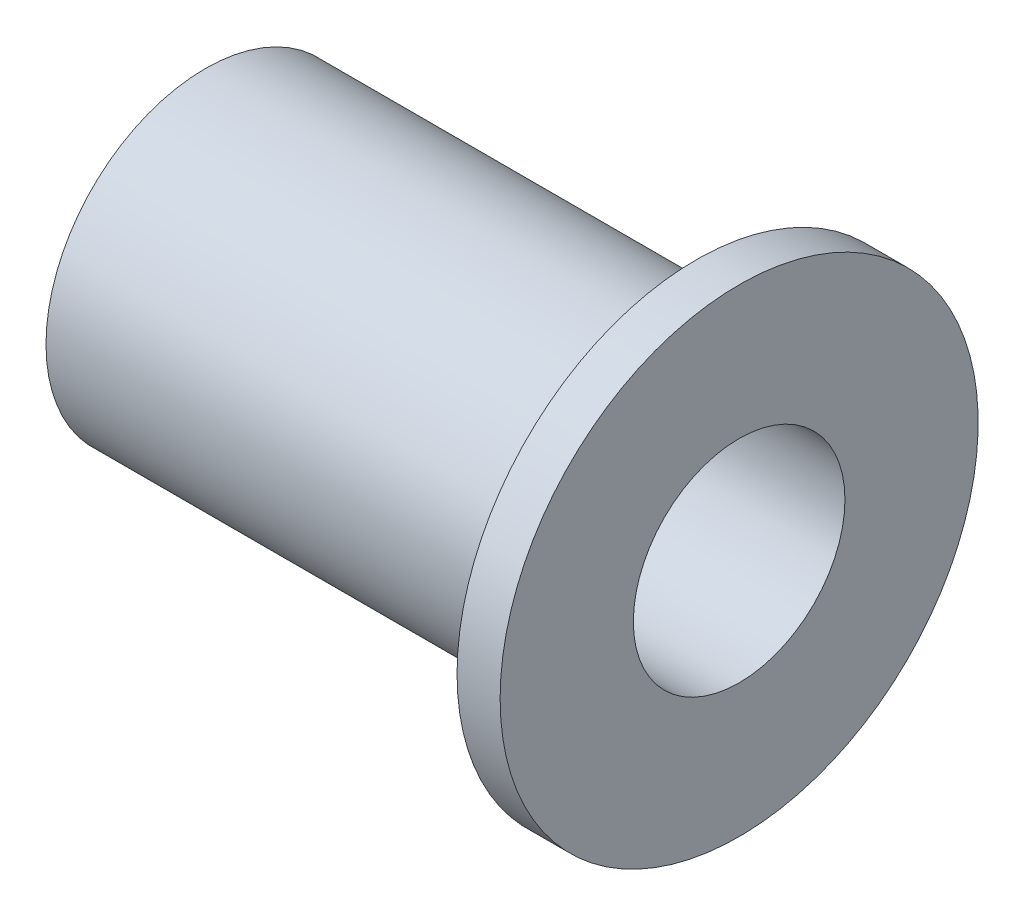
ISO-10303-21;
HEADER;
FILE_DESCRIPTION(('STEP AP214'),'2;1');
FILE_NAME('part.step','',(''),(''),'','','');
FILE_SCHEMA(('AUTOMOTIVE_DESIGN { 1 0 10303 214 1 1 1 1 }'));
ENDSEC;
DATA;
#1=APPLICATION_CONTEXT('core data for automotive mechanical design processes');
#2=APPLICATION_PROTOCOL_DEFINITION('international standard','automotive_design',2000,#1);
#3=PRODUCT_CONTEXT('',#1,'mechanical');
#4=PRODUCT('Part','Part','',(#3));
#5=PRODUCT_RELATED_PRODUCT_CATEGORY('part','',(#4));
#6=PRODUCT_DEFINITION_FORMATION('','',#4);
#7=PRODUCT_DEFINITION_CONTEXT('part definition',#1,'design');
#8=PRODUCT_DEFINITION('design','',#6,#7);
#9=PRODUCT_DEFINITION_SHAPE('','',#8);
#10=(LENGTH_UNIT() NAMED_UNIT(*) SI_UNIT(.MILLI.,.METRE.));
#11=(NAMED_UNIT(*) PLANE_ANGLE_UNIT() SI_UNIT($,.RADIAN.));
#12=(NAMED_UNIT(*) SI_UNIT($,.STERADIAN.) SOLID_ANGLE_UNIT());
#13=UNCERTAINTY_MEASURE_WITH_UNIT(LENGTH_MEASURE(1.E-05),#10,'distance_accuracy_value','');
#14=(GEOMETRIC_REPRESENTATION_CONTEXT(3) GLOBAL_UNCERTAINTY_ASSIGNED_CONTEXT((#13)) GLOBAL_UNIT_ASSIGNED_CONTEXT((#10,
#11,#12)) REPRESENTATION_CONTEXT('',''));
#15=CARTESIAN_POINT('',(0.,0.,0.));
#16=DIRECTION('',(0.,0.,1.));
#17=DIRECTION('',(1.,0.,0.));
#18=AXIS2_PLACEMENT_3D('',#15,#16,#17);
#19=CARTESIAN_POINT('',(0.,0.,0.));
#20=DIRECTION('',(-1.,0.,0.));
#21=DIRECTION('',(0.,0.,1.));
#22=AXIS2_PLACEMENT_3D('',#19,#20,#21);
#23=CYLINDRICAL_SURFACE('',#22,1.99);
#24=CARTESIAN_POINT('',(0.,0.,0.));
#25=DIRECTION('',(-1.,0.,0.));
#26=DIRECTION('',(0.,0.,1.));
#27=AXIS2_PLACEMENT_3D('',#24,#25,#26);
#28=CIRCLE('',#27,1.99);
#29=CARTESIAN_POINT('',(0.,0.,1.99));
#30=VERTEX_POINT('',#29);
#31=EDGE_CURVE('E10',#30,#30,#28,.T.);
#32=ORIENTED_EDGE('',*,*,#31,.T.);
#33=EDGE_LOOP('',(#32));
#34=FACE_BOUND('',#33,.T.);
#35=CARTESIAN_POINT('',(10.04,0.,0.));
#36=DIRECTION('',(-1.,0.,0.));
#37=DIRECTION('',(0.,0.,1.));
#38=AXIS2_PLACEMENT_3D('',#35,#36,#37);
#39=CIRCLE('',#38,1.99);
#40=CARTESIAN_POINT('',(10.04,0.,1.99));
#41=VERTEX_POINT('',#40);
#42=EDGE_CURVE('E54',#41,#41,#39,.T.);
#43=ORIENTED_EDGE('',*,*,#42,.F.);
#44=EDGE_LOOP('',(#43));
#45=FACE_BOUND('',#44,.T.);
#46=ADVANCED_FACE('F32',(#34,#45),#23,.F.);
#47=CARTESIAN_POINT('',(0.,-1.99,0.));
#48=DIRECTION('',(-1.,0.,0.));
#49=DIRECTION('',(0.,0.,1.));
#50=AXIS2_PLACEMENT_3D('',#47,#48,#49);
#51=PLANE('',#50);
#52=CARTESIAN_POINT('',(0.,0.,0.));
#53=DIRECTION('',(-1.,0.,0.));
#54=DIRECTION('',(0.,0.,1.));
#55=AXIS2_PLACEMENT_3D('',#52,#53,#54);
#56=CIRCLE('',#55,2.995);
#57=CARTESIAN_POINT('',(0.,0.,2.995));
#58=VERTEX_POINT('',#57);
#59=EDGE_CURVE('E38',#58,#58,#56,.T.);
#60=ORIENTED_EDGE('',*,*,#59,.T.);
#61=EDGE_LOOP('',(#60));
#62=FACE_BOUND('',#61,.T.);
#63=ORIENTED_EDGE('',*,*,#31,.F.);
#64=EDGE_LOOP('',(#63));
#65=FACE_BOUND('',#64,.T.);
#66=ADVANCED_FACE('F62',(#62,#65),#51,.T.);
#67=CARTESIAN_POINT('',(0.,0.,0.));
#68=DIRECTION('',(-1.,0.,0.));
#69=DIRECTION('',(0.,0.,1.));
#70=AXIS2_PLACEMENT_3D('',#67,#68,#69);
#71=CYLINDRICAL_SURFACE('',#70,2.995);
#72=CARTESIAN_POINT('',(9.23,0.,0.));
#73=DIRECTION('',(-1.,0.,0.));
#74=DIRECTION('',(0.,0.,1.));
#75=AXIS2_PLACEMENT_3D('',#72,#73,#74);
#76=CIRCLE('',#75,2.995);
#77=CARTESIAN_POINT('',(9.23,0.,2.995));
#78=VERTEX_POINT('',#77);
#79=EDGE_CURVE('E42',#78,#78,#76,.T.);
#80=ORIENTED_EDGE('',*,*,#79,.T.);
#81=EDGE_LOOP('',(#80));
#82=FACE_BOUND('',#81,.T.);
#83=ORIENTED_EDGE('',*,*,#59,.F.);
#84=EDGE_LOOP('',(#83));
#85=FACE_BOUND('',#84,.T.);
#86=ADVANCED_FACE('F66',(#82,#85),#71,.T.);
#87=CARTESIAN_POINT('',(9.23,-2.995,0.));
#88=DIRECTION('',(-1.,0.,0.));
#89=DIRECTION('',(0.,0.,1.));
#90=AXIS2_PLACEMENT_3D('',#87,#88,#89);
#91=PLANE('',#90);
#92=CARTESIAN_POINT('',(9.23,0.,0.));
#93=DIRECTION('',(-1.,0.,0.));
#94=DIRECTION('',(0.,0.,1.));
#95=AXIS2_PLACEMENT_3D('',#92,#93,#94);
#96=CIRCLE('',#95,4.495);
#97=CARTESIAN_POINT('',(9.23,0.,4.495));
#98=VERTEX_POINT('',#97);
#99=EDGE_CURVE('E46',#98,#98,#96,.T.);
#100=ORIENTED_EDGE('',*,*,#99,.T.);
#101=EDGE_LOOP('',(#100));
#102=FACE_BOUND('',#101,.T.);
#103=ORIENTED_EDGE('',*,*,#79,.F.);
#104=EDGE_LOOP('',(#103));
#105=FACE_BOUND('',#104,.T.);
#106=ADVANCED_FACE('F70',(#102,#105),#91,.T.);
#107=CARTESIAN_POINT('',(0.,0.,0.));
#108=DIRECTION('',(-1.,0.,0.));
#109=DIRECTION('',(0.,0.,1.));
#110=AXIS2_PLACEMENT_3D('',#107,#108,#109);
#111=CYLINDRICAL_SURFACE('',#110,4.495);
#112=CARTESIAN_POINT('',(10.04,0.,0.));
#113=DIRECTION('',(-1.,0.,0.));
#114=DIRECTION('',(0.,0.,1.));
#115=AXIS2_PLACEMENT_3D('',#112,#113,#114);
#116=CIRCLE('',#115,4.495);
#117=CARTESIAN_POINT('',(10.04,0.,4.495));
#118=VERTEX_POINT('',#117);
#119=EDGE_CURVE('E51',#118,#118,#116,.T.);
#120=ORIENTED_EDGE('',*,*,#119,.T.);
#121=EDGE_LOOP('',(#120));
#122=FACE_BOUND('',#121,.T.);
#123=ORIENTED_EDGE('',*,*,#99,.F.);
#124=EDGE_LOOP('',(#123));
#125=FACE_BOUND('',#124,.T.);
#126=ADVANCED_FACE('F77',(#122,#125),#111,.T.);
#127=CARTESIAN_POINT('',(10.04,-4.495,0.));
#128=DIRECTION('',(1.,0.,0.));
#129=DIRECTION('',(0.,0.,-1.));
#130=AXIS2_PLACEMENT_3D('',#127,#128,#129);
#131=PLANE('',#130);
#132=ORIENTED_EDGE('',*,*,#42,.T.);
#133=EDGE_LOOP('',(#132));
#134=FACE_BOUND('',#133,.T.);
#135=ORIENTED_EDGE('',*,*,#119,.F.);
#136=EDGE_LOOP('',(#135));
#137=FACE_BOUND('',#136,.T.);
#138=ADVANCED_FACE('F58',(#134,#137),#131,.T.);
#139=CLOSED_SHELL('',(#46,#66,#86,#106,#126,#138));
#140=MANIFOLD_SOLID_BREP('B2',#139);
#141=ADVANCED_BREP_SHAPE_REPRESENTATION('',(#18,#140),#14);
#142=SHAPE_DEFINITION_REPRESENTATION(#9,#141);
ENDSEC;
END-ISO-10303-21;
